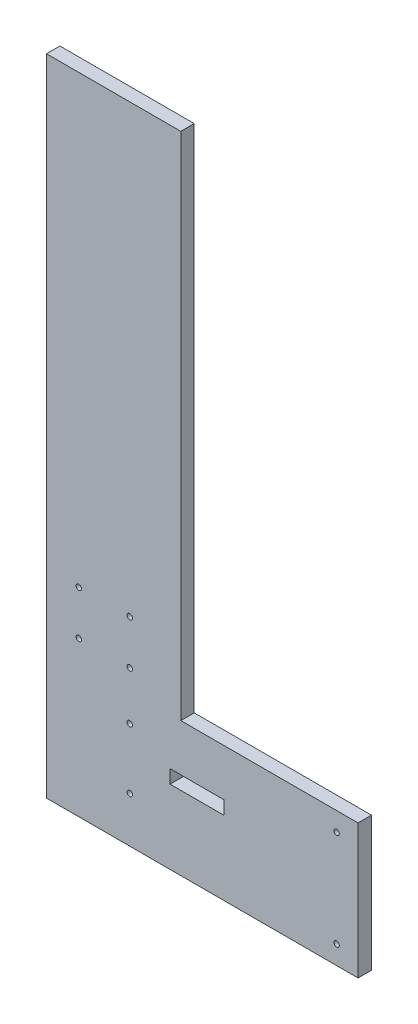
ISO-10303-21;
HEADER;
FILE_DESCRIPTION(('STEP AP214'),'2;1');
FILE_NAME('part.step','',(''),(''),'','','');
FILE_SCHEMA(('AUTOMOTIVE_DESIGN { 1 0 10303 214 1 1 1 1 }'));
ENDSEC;
DATA;
#1=APPLICATION_CONTEXT('core data for automotive mechanical design processes');
#2=APPLICATION_PROTOCOL_DEFINITION('international standard','automotive_design',2000,#1);
#3=PRODUCT_CONTEXT('',#1,'mechanical');
#4=PRODUCT('Part','Part','',(#3));
#5=PRODUCT_RELATED_PRODUCT_CATEGORY('part','',(#4));
#6=PRODUCT_DEFINITION_FORMATION('','',#4);
#7=PRODUCT_DEFINITION_CONTEXT('part definition',#1,'design');
#8=PRODUCT_DEFINITION('design','',#6,#7);
#9=PRODUCT_DEFINITION_SHAPE('','',#8);
#10=(LENGTH_UNIT() NAMED_UNIT(*) SI_UNIT(.MILLI.,.METRE.));
#11=(NAMED_UNIT(*) PLANE_ANGLE_UNIT() SI_UNIT($,.RADIAN.));
#12=(NAMED_UNIT(*) SI_UNIT($,.STERADIAN.) SOLID_ANGLE_UNIT());
#13=UNCERTAINTY_MEASURE_WITH_UNIT(LENGTH_MEASURE(1.E-05),#10,'distance_accuracy_value','');
#14=(GEOMETRIC_REPRESENTATION_CONTEXT(3) GLOBAL_UNCERTAINTY_ASSIGNED_CONTEXT((#13)) GLOBAL_UNIT_ASSIGNED_CONTEXT((#10,
#11,#12)) REPRESENTATION_CONTEXT('',''));
#15=CARTESIAN_POINT('',(0.,0.,0.));
#16=DIRECTION('',(0.,0.,1.));
#17=DIRECTION('',(1.,0.,0.));
#18=AXIS2_PLACEMENT_3D('',#15,#16,#17);
#19=CARTESIAN_POINT('',(0.,60.,5.));
#20=DIRECTION('',(0.,1.,0.));
#21=DIRECTION('',(-1.,0.,0.));
#22=AXIS2_PLACEMENT_3D('',#19,#20,#21);
#23=PLANE('',#22);
#24=DIRECTION('',(1.,0.,0.));
#25=VECTOR('',#24,1.);
#26=CARTESIAN_POINT('',(0.,60.,0.));
#27=LINE('',#26,#25);
#28=CARTESIAN_POINT('',(130.,60.,0.));
#29=VERTEX_POINT('',#28);
#30=CARTESIAN_POINT('',(246.,60.,0.));
#31=VERTEX_POINT('',#30);
#32=EDGE_CURVE('E186',#29,#31,#27,.T.);
#33=ORIENTED_EDGE('',*,*,#32,.T.);
#34=DIRECTION('',(0.,0.,-1.));
#35=VECTOR('',#34,1.);
#36=CARTESIAN_POINT('',(246.,60.,5.));
#37=LINE('',#36,#35);
#38=CARTESIAN_POINT('',(246.,60.,5.));
#39=VERTEX_POINT('',#38);
#40=EDGE_CURVE('E11',#39,#31,#37,.T.);
#41=ORIENTED_EDGE('',*,*,#40,.F.);
#42=DIRECTION('',(1.,0.,0.));
#43=VECTOR('',#42,1.);
#44=CARTESIAN_POINT('',(0.,60.,5.));
#45=LINE('',#44,#43);
#46=CARTESIAN_POINT('',(130.,60.,5.));
#47=VERTEX_POINT('',#46);
#48=EDGE_CURVE('E116',#47,#39,#45,.T.);
#49=ORIENTED_EDGE('',*,*,#48,.F.);
#50=DIRECTION('',(0.,0.,1.));
#51=VECTOR('',#50,1.);
#52=CARTESIAN_POINT('',(130.,60.,0.));
#53=LINE('',#52,#51);
#54=EDGE_CURVE('E126',#29,#47,#53,.T.);
#55=ORIENTED_EDGE('',*,*,#54,.F.);
#56=EDGE_LOOP('',(#33,#41,#49,#55));
#57=FACE_BOUND('',#56,.T.);
#58=ADVANCED_FACE('F35',(#57),#23,.F.);
#59=CARTESIAN_POINT('',(246.,0.,5.));
#60=DIRECTION('',(1.,0.,0.));
#61=DIRECTION('',(0.,0.,-1.));
#62=AXIS2_PLACEMENT_3D('',#59,#60,#61);
#63=PLANE('',#62);
#64=DIRECTION('',(0.,-1.,0.));
#65=VECTOR('',#64,1.);
#66=CARTESIAN_POINT('',(246.,0.,0.));
#67=LINE('',#66,#65);
#68=CARTESIAN_POINT('',(246.,110.,0.));
#69=VERTEX_POINT('',#68);
#70=EDGE_CURVE('E213',#69,#31,#67,.T.);
#71=ORIENTED_EDGE('',*,*,#70,.F.);
#72=DIRECTION('',(0.,0.,-1.));
#73=VECTOR('',#72,1.);
#74=CARTESIAN_POINT('',(246.,110.,5.));
#75=LINE('',#74,#73);
#76=CARTESIAN_POINT('',(246.,110.,5.));
#77=VERTEX_POINT('',#76);
#78=EDGE_CURVE('E42',#77,#69,#75,.T.);
#79=ORIENTED_EDGE('',*,*,#78,.F.);
#80=DIRECTION('',(0.,-1.,0.));
#81=VECTOR('',#80,1.);
#82=CARTESIAN_POINT('',(246.,0.,5.));
#83=LINE('',#82,#81);
#84=EDGE_CURVE('E128',#77,#39,#83,.T.);
#85=ORIENTED_EDGE('',*,*,#84,.T.);
#86=ORIENTED_EDGE('',*,*,#40,.T.);
#87=EDGE_LOOP('',(#71,#79,#85,#86));
#88=FACE_BOUND('',#87,.T.);
#89=ADVANCED_FACE('F242',(#88),#63,.T.);
#90=CARTESIAN_POINT('',(0.,110.,5.));
#91=DIRECTION('',(0.,1.,0.));
#92=DIRECTION('',(0.,0.,1.));
#93=AXIS2_PLACEMENT_3D('',#90,#91,#92);
#94=PLANE('',#93);
#95=DIRECTION('',(1.,0.,0.));
#96=VECTOR('',#95,1.);
#97=CARTESIAN_POINT('',(0.,110.,0.));
#98=LINE('',#97,#96);
#99=CARTESIAN_POINT('',(180.,110.,0.));
#100=VERTEX_POINT('',#99);
#101=EDGE_CURVE('E211',#100,#69,#98,.T.);
#102=ORIENTED_EDGE('',*,*,#101,.F.);
#103=DIRECTION('',(0.,0.,-1.));
#104=VECTOR('',#103,1.);
#105=CARTESIAN_POINT('',(180.,110.,5.));
#106=LINE('',#105,#104);
#107=CARTESIAN_POINT('',(180.,110.,5.));
#108=VERTEX_POINT('',#107);
#109=EDGE_CURVE('E235',#108,#100,#106,.T.);
#110=ORIENTED_EDGE('',*,*,#109,.F.);
#111=DIRECTION('',(1.,0.,0.));
#112=VECTOR('',#111,1.);
#113=CARTESIAN_POINT('',(0.,110.,5.));
#114=LINE('',#113,#112);
#115=EDGE_CURVE('E190',#108,#77,#114,.T.);
#116=ORIENTED_EDGE('',*,*,#115,.T.);
#117=ORIENTED_EDGE('',*,*,#78,.T.);
#118=EDGE_LOOP('',(#102,#110,#116,#117));
#119=FACE_BOUND('',#118,.T.);
#120=ADVANCED_FACE('F239',(#119),#94,.T.);
#121=CARTESIAN_POINT('',(180.,0.,5.));
#122=DIRECTION('',(-1.,0.,0.));
#123=DIRECTION('',(0.,-1.,0.));
#124=AXIS2_PLACEMENT_3D('',#121,#122,#123);
#125=PLANE('',#124);
#126=DIRECTION('',(0.,1.,0.));
#127=VECTOR('',#126,1.);
#128=CARTESIAN_POINT('',(180.,0.,0.));
#129=LINE('',#128,#127);
#130=CARTESIAN_POINT('',(180.,300.,0.));
#131=VERTEX_POINT('',#130);
#132=EDGE_CURVE('E208',#100,#131,#129,.T.);
#133=ORIENTED_EDGE('',*,*,#132,.T.);
#134=DIRECTION('',(0.,0.,-1.));
#135=VECTOR('',#134,1.);
#136=CARTESIAN_POINT('',(180.,300.,5.));
#137=LINE('',#136,#135);
#138=CARTESIAN_POINT('',(180.,300.,5.));
#139=VERTEX_POINT('',#138);
#140=EDGE_CURVE('E232',#139,#131,#137,.T.);
#141=ORIENTED_EDGE('',*,*,#140,.F.);
#142=DIRECTION('',(0.,1.,0.));
#143=VECTOR('',#142,1.);
#144=CARTESIAN_POINT('',(180.,0.,5.));
#145=LINE('',#144,#143);
#146=EDGE_CURVE('E189',#108,#139,#145,.T.);
#147=ORIENTED_EDGE('',*,*,#146,.F.);
#148=ORIENTED_EDGE('',*,*,#109,.T.);
#149=EDGE_LOOP('',(#133,#141,#147,#148));
#150=FACE_BOUND('',#149,.T.);
#151=ADVANCED_FACE('F250',(#150),#125,.F.);
#152=CARTESIAN_POINT('',(0.,300.,5.));
#153=DIRECTION('',(0.,-1.,0.));
#154=DIRECTION('',(0.,0.,-1.));
#155=AXIS2_PLACEMENT_3D('',#152,#153,#154);
#156=PLANE('',#155);
#157=DIRECTION('',(-1.,0.,0.));
#158=VECTOR('',#157,1.);
#159=CARTESIAN_POINT('',(0.,300.,0.));
#160=LINE('',#159,#158);
#161=CARTESIAN_POINT('',(130.,300.,0.));
#162=VERTEX_POINT('',#161);
#163=EDGE_CURVE('E210',#131,#162,#160,.T.);
#164=ORIENTED_EDGE('',*,*,#163,.T.);
#165=DIRECTION('',(0.,0.,-1.));
#166=VECTOR('',#165,1.);
#167=CARTESIAN_POINT('',(130.,300.,5.));
#168=LINE('',#167,#166);
#169=CARTESIAN_POINT('',(130.,300.,5.));
#170=VERTEX_POINT('',#169);
#171=EDGE_CURVE('E207',#170,#162,#168,.T.);
#172=ORIENTED_EDGE('',*,*,#171,.F.);
#173=DIRECTION('',(-1.,0.,0.));
#174=VECTOR('',#173,1.);
#175=CARTESIAN_POINT('',(0.,300.,5.));
#176=LINE('',#175,#174);
#177=EDGE_CURVE('E119',#139,#170,#176,.T.);
#178=ORIENTED_EDGE('',*,*,#177,.F.);
#179=ORIENTED_EDGE('',*,*,#140,.T.);
#180=EDGE_LOOP('',(#164,#172,#178,#179));
#181=FACE_BOUND('',#180,.T.);
#182=ADVANCED_FACE('F253',(#181),#156,.F.);
#183=CARTESIAN_POINT('',(130.,0.,5.));
#184=DIRECTION('',(1.,0.,0.));
#185=DIRECTION('',(0.,1.,0.));
#186=AXIS2_PLACEMENT_3D('',#183,#184,#185);
#187=PLANE('',#186);
#188=DIRECTION('',(0.,-1.,0.));
#189=VECTOR('',#188,1.);
#190=CARTESIAN_POINT('',(130.,0.,0.));
#191=LINE('',#190,#189);
#192=EDGE_CURVE('E49',#162,#29,#191,.T.);
#193=ORIENTED_EDGE('',*,*,#192,.T.);
#194=ORIENTED_EDGE('',*,*,#54,.T.);
#195=DIRECTION('',(0.,-1.,0.));
#196=VECTOR('',#195,1.);
#197=CARTESIAN_POINT('',(130.,0.,5.));
#198=LINE('',#197,#196);
#199=EDGE_CURVE('E111',#170,#47,#198,.T.);
#200=ORIENTED_EDGE('',*,*,#199,.F.);
#201=ORIENTED_EDGE('',*,*,#171,.T.);
#202=EDGE_LOOP('',(#193,#194,#200,#201));
#203=FACE_BOUND('',#202,.T.);
#204=ADVANCED_FACE('F131',(#203),#187,.F.);
#205=CARTESIAN_POINT('',(142.,117.5,5.));
#206=DIRECTION('',(0.,0.,-1.));
#207=DIRECTION('',(-1.,0.,0.));
#208=AXIS2_PLACEMENT_3D('',#205,#206,#207);
#209=CYLINDRICAL_SURFACE('',#208,0.999999999999998);
#210=CARTESIAN_POINT('',(142.,117.5,5.));
#211=DIRECTION('',(0.,0.,1.));
#212=DIRECTION('',(1.,0.,0.));
#213=AXIS2_PLACEMENT_3D('',#210,#211,#212);
#214=CIRCLE('',#213,0.999999999999998);
#215=CARTESIAN_POINT('',(143.,117.5,5.));
#216=VERTEX_POINT('',#215);
#217=EDGE_CURVE('E201',#216,#216,#214,.F.);
#218=ORIENTED_EDGE('',*,*,#217,.F.);
#219=EDGE_LOOP('',(#218));
#220=FACE_BOUND('',#219,.T.);
#221=CARTESIAN_POINT('',(142.,117.5,0.));
#222=DIRECTION('',(0.,0.,1.));
#223=DIRECTION('',(1.,0.,0.));
#224=AXIS2_PLACEMENT_3D('',#221,#222,#223);
#225=CIRCLE('',#224,0.999999999999998);
#226=CARTESIAN_POINT('',(143.,117.5,0.));
#227=VERTEX_POINT('',#226);
#228=EDGE_CURVE('E226',#227,#227,#225,.F.);
#229=ORIENTED_EDGE('',*,*,#228,.T.);
#230=EDGE_LOOP('',(#229));
#231=FACE_BOUND('',#230,.T.);
#232=ADVANCED_FACE('F261',(#220,#231),#209,.F.);
#233=CARTESIAN_POINT('',(161.,117.5,5.));
#234=DIRECTION('',(0.,0.,-1.));
#235=DIRECTION('',(-1.,0.,0.));
#236=AXIS2_PLACEMENT_3D('',#233,#234,#235);
#237=CYLINDRICAL_SURFACE('',#236,0.999999999999998);
#238=CARTESIAN_POINT('',(161.,117.5,5.));
#239=DIRECTION('',(0.,0.,1.));
#240=DIRECTION('',(1.,0.,0.));
#241=AXIS2_PLACEMENT_3D('',#238,#239,#240);
#242=CIRCLE('',#241,0.999999999999998);
#243=CARTESIAN_POINT('',(162.,117.5,5.));
#244=VERTEX_POINT('',#243);
#245=EDGE_CURVE('E198',#244,#244,#242,.F.);
#246=ORIENTED_EDGE('',*,*,#245,.F.);
#247=EDGE_LOOP('',(#246));
#248=FACE_BOUND('',#247,.T.);
#249=CARTESIAN_POINT('',(161.,117.5,0.));
#250=DIRECTION('',(0.,0.,1.));
#251=DIRECTION('',(1.,0.,0.));
#252=AXIS2_PLACEMENT_3D('',#249,#250,#251);
#253=CIRCLE('',#252,0.999999999999998);
#254=CARTESIAN_POINT('',(162.,117.5,0.));
#255=VERTEX_POINT('',#254);
#256=EDGE_CURVE('E223',#255,#255,#253,.F.);
#257=ORIENTED_EDGE('',*,*,#256,.T.);
#258=EDGE_LOOP('',(#257));
#259=FACE_BOUND('',#258,.T.);
#260=ADVANCED_FACE('F292',(#248,#259),#237,.F.);
#261=CARTESIAN_POINT('',(142.,134.,5.));
#262=DIRECTION('',(0.,0.,-1.));
#263=DIRECTION('',(-1.,0.,0.));
#264=AXIS2_PLACEMENT_3D('',#261,#262,#263);
#265=CYLINDRICAL_SURFACE('',#264,0.999999999999998);
#266=CARTESIAN_POINT('',(142.,134.,5.));
#267=DIRECTION('',(0.,0.,1.));
#268=DIRECTION('',(1.,0.,0.));
#269=AXIS2_PLACEMENT_3D('',#266,#267,#268);
#270=CIRCLE('',#269,0.999999999999998);
#271=CARTESIAN_POINT('',(143.,134.,5.));
#272=VERTEX_POINT('',#271);
#273=EDGE_CURVE('E121',#272,#272,#270,.F.);
#274=ORIENTED_EDGE('',*,*,#273,.F.);
#275=EDGE_LOOP('',(#274));
#276=FACE_BOUND('',#275,.T.);
#277=CARTESIAN_POINT('',(142.,134.,0.));
#278=DIRECTION('',(0.,0.,1.));
#279=DIRECTION('',(1.,0.,0.));
#280=AXIS2_PLACEMENT_3D('',#277,#278,#279);
#281=CIRCLE('',#280,0.999999999999998);
#282=CARTESIAN_POINT('',(143.,134.,0.));
#283=VERTEX_POINT('',#282);
#284=EDGE_CURVE('E220',#283,#283,#281,.F.);
#285=ORIENTED_EDGE('',*,*,#284,.T.);
#286=EDGE_LOOP('',(#285));
#287=FACE_BOUND('',#286,.T.);
#288=ADVANCED_FACE('F302',(#276,#287),#265,.F.);
#289=CARTESIAN_POINT('',(161.,134.,5.));
#290=DIRECTION('',(0.,0.,-1.));
#291=DIRECTION('',(-1.,0.,0.));
#292=AXIS2_PLACEMENT_3D('',#289,#290,#291);
#293=CYLINDRICAL_SURFACE('',#292,0.999999999999998);
#294=CARTESIAN_POINT('',(161.,134.,5.));
#295=DIRECTION('',(0.,0.,1.));
#296=DIRECTION('',(1.,0.,0.));
#297=AXIS2_PLACEMENT_3D('',#294,#295,#296);
#298=CIRCLE('',#297,0.999999999999998);
#299=CARTESIAN_POINT('',(162.,134.,5.));
#300=VERTEX_POINT('',#299);
#301=EDGE_CURVE('E204',#300,#300,#298,.F.);
#302=ORIENTED_EDGE('',*,*,#301,.F.);
#303=EDGE_LOOP('',(#302));
#304=FACE_BOUND('',#303,.T.);
#305=CARTESIAN_POINT('',(161.,134.,0.));
#306=DIRECTION('',(0.,0.,1.));
#307=DIRECTION('',(1.,0.,0.));
#308=AXIS2_PLACEMENT_3D('',#305,#306,#307);
#309=CIRCLE('',#308,0.999999999999998);
#310=CARTESIAN_POINT('',(162.,134.,0.));
#311=VERTEX_POINT('',#310);
#312=EDGE_CURVE('E129',#311,#311,#309,.F.);
#313=ORIENTED_EDGE('',*,*,#312,.T.);
#314=EDGE_LOOP('',(#313));
#315=FACE_BOUND('',#314,.T.);
#316=ADVANCED_FACE('F312',(#304,#315),#293,.F.);
#317=CARTESIAN_POINT('',(0.,0.,5.));
#318=DIRECTION('',(0.,0.,1.));
#319=DIRECTION('',(1.,0.,0.));
#320=AXIS2_PLACEMENT_3D('',#317,#318,#319);
#321=PLANE('',#320);
#322=ORIENTED_EDGE('',*,*,#199,.T.);
#323=ORIENTED_EDGE('',*,*,#48,.T.);
#324=ORIENTED_EDGE('',*,*,#84,.F.);
#325=ORIENTED_EDGE('',*,*,#115,.F.);
#326=ORIENTED_EDGE('',*,*,#146,.T.);
#327=ORIENTED_EDGE('',*,*,#177,.T.);
#328=EDGE_LOOP('',(#322,#323,#324,#325,#326,#327));
#329=FACE_BOUND('',#328,.T.);
#330=DIRECTION('',(-1.,0.,0.));
#331=VECTOR('',#330,1.);
#332=CARTESIAN_POINT('',(196.,92.5,5.));
#333=LINE('',#332,#331);
#334=CARTESIAN_POINT('',(196.,92.5,5.));
#335=VERTEX_POINT('',#334);
#336=CARTESIAN_POINT('',(176.,92.5,5.));
#337=VERTEX_POINT('',#336);
#338=EDGE_CURVE('E57',#335,#337,#333,.T.);
#339=ORIENTED_EDGE('',*,*,#338,.F.);
#340=DIRECTION('',(0.,1.,0.));
#341=VECTOR('',#340,1.);
#342=CARTESIAN_POINT('',(196.,92.5,5.));
#343=LINE('',#342,#341);
#344=CARTESIAN_POINT('',(196.,87.5,5.));
#345=VERTEX_POINT('',#344);
#346=EDGE_CURVE('E140',#345,#335,#343,.T.);
#347=ORIENTED_EDGE('',*,*,#346,.F.);
#348=DIRECTION('',(1.,0.,0.));
#349=VECTOR('',#348,1.);
#350=CARTESIAN_POINT('',(196.,87.5,5.));
#351=LINE('',#350,#349);
#352=CARTESIAN_POINT('',(176.,87.5,5.));
#353=VERTEX_POINT('',#352);
#354=EDGE_CURVE('E152',#353,#345,#351,.T.);
#355=ORIENTED_EDGE('',*,*,#354,.F.);
#356=DIRECTION('',(0.,-1.,0.));
#357=VECTOR('',#356,1.);
#358=CARTESIAN_POINT('',(176.,92.5,5.));
#359=LINE('',#358,#357);
#360=EDGE_CURVE('E133',#337,#353,#359,.T.);
#361=ORIENTED_EDGE('',*,*,#360,.F.);
#362=EDGE_LOOP('',(#339,#347,#355,#361));
#363=FACE_BOUND('',#362,.T.);
#364=CARTESIAN_POINT('',(161.,99.5,5.));
#365=DIRECTION('',(0.,0.,1.));
#366=DIRECTION('',(-1.,0.,0.));
#367=AXIS2_PLACEMENT_3D('',#364,#365,#366);
#368=CIRCLE('',#367,1.00000000000002);
#369=CARTESIAN_POINT('',(160.,99.5,5.));
#370=VERTEX_POINT('',#369);
#371=EDGE_CURVE('E159',#370,#370,#368,.T.);
#372=ORIENTED_EDGE('',*,*,#371,.F.);
#373=EDGE_LOOP('',(#372));
#374=FACE_BOUND('',#373,.T.);
#375=CARTESIAN_POINT('',(161.,77.,5.));
#376=DIRECTION('',(0.,0.,1.));
#377=DIRECTION('',(-1.,0.,0.));
#378=AXIS2_PLACEMENT_3D('',#375,#376,#377);
#379=CIRCLE('',#378,1.00000000000002);
#380=CARTESIAN_POINT('',(160.,77.,5.));
#381=VERTEX_POINT('',#380);
#382=EDGE_CURVE('E168',#381,#381,#379,.T.);
#383=ORIENTED_EDGE('',*,*,#382,.F.);
#384=EDGE_LOOP('',(#383));
#385=FACE_BOUND('',#384,.T.);
#386=CARTESIAN_POINT('',(238.,103.,5.));
#387=DIRECTION('',(0.,0.,1.));
#388=DIRECTION('',(-1.,0.,0.));
#389=AXIS2_PLACEMENT_3D('',#386,#387,#388);
#390=CIRCLE('',#389,0.999999999999998);
#391=CARTESIAN_POINT('',(237.,103.,5.));
#392=VERTEX_POINT('',#391);
#393=EDGE_CURVE('E174',#392,#392,#390,.T.);
#394=ORIENTED_EDGE('',*,*,#393,.F.);
#395=EDGE_LOOP('',(#394));
#396=FACE_BOUND('',#395,.T.);
#397=CARTESIAN_POINT('',(238.,67.,5.));
#398=DIRECTION('',(0.,0.,1.));
#399=DIRECTION('',(-1.,0.,0.));
#400=AXIS2_PLACEMENT_3D('',#397,#398,#399);
#401=CIRCLE('',#400,0.999999999999998);
#402=CARTESIAN_POINT('',(237.,67.,5.));
#403=VERTEX_POINT('',#402);
#404=EDGE_CURVE('E180',#403,#403,#401,.T.);
#405=ORIENTED_EDGE('',*,*,#404,.F.);
#406=EDGE_LOOP('',(#405));
#407=FACE_BOUND('',#406,.T.);
#408=ORIENTED_EDGE('',*,*,#273,.T.);
#409=EDGE_LOOP('',(#408));
#410=FACE_BOUND('',#409,.T.);
#411=ORIENTED_EDGE('',*,*,#245,.T.);
#412=EDGE_LOOP('',(#411));
#413=FACE_BOUND('',#412,.T.);
#414=ORIENTED_EDGE('',*,*,#217,.T.);
#415=EDGE_LOOP('',(#414));
#416=FACE_BOUND('',#415,.T.);
#417=ORIENTED_EDGE('',*,*,#301,.T.);
#418=EDGE_LOOP('',(#417));
#419=FACE_BOUND('',#418,.T.);
#420=ADVANCED_FACE('F113',(#329,#363,#374,#385,#396,#407,#410,#413,#416,#419),#321,.T.);
#421=CARTESIAN_POINT('',(0.,0.,0.));
#422=DIRECTION('',(0.,0.,1.));
#423=DIRECTION('',(1.,0.,0.));
#424=AXIS2_PLACEMENT_3D('',#421,#422,#423);
#425=PLANE('',#424);
#426=DIRECTION('',(0.,1.,0.));
#427=VECTOR('',#426,1.);
#428=CARTESIAN_POINT('',(196.,92.5,0.));
#429=LINE('',#428,#427);
#430=CARTESIAN_POINT('',(196.,87.5,0.));
#431=VERTEX_POINT('',#430);
#432=CARTESIAN_POINT('',(196.,92.5,0.));
#433=VERTEX_POINT('',#432);
#434=EDGE_CURVE('E146',#431,#433,#429,.T.);
#435=ORIENTED_EDGE('',*,*,#434,.T.);
#436=DIRECTION('',(-1.,0.,0.));
#437=VECTOR('',#436,1.);
#438=CARTESIAN_POINT('',(196.,92.5,0.));
#439=LINE('',#438,#437);
#440=CARTESIAN_POINT('',(176.,92.5,0.));
#441=VERTEX_POINT('',#440);
#442=EDGE_CURVE('E136',#433,#441,#439,.T.);
#443=ORIENTED_EDGE('',*,*,#442,.T.);
#444=DIRECTION('',(0.,-1.,0.));
#445=VECTOR('',#444,1.);
#446=CARTESIAN_POINT('',(176.,92.5,0.));
#447=LINE('',#446,#445);
#448=CARTESIAN_POINT('',(176.,87.5,0.));
#449=VERTEX_POINT('',#448);
#450=EDGE_CURVE('E139',#441,#449,#447,.T.);
#451=ORIENTED_EDGE('',*,*,#450,.T.);
#452=DIRECTION('',(1.,0.,0.));
#453=VECTOR('',#452,1.);
#454=CARTESIAN_POINT('',(196.,87.5,0.));
#455=LINE('',#454,#453);
#456=EDGE_CURVE('E143',#449,#431,#455,.T.);
#457=ORIENTED_EDGE('',*,*,#456,.T.);
#458=EDGE_LOOP('',(#435,#443,#451,#457));
#459=FACE_BOUND('',#458,.T.);
#460=CARTESIAN_POINT('',(161.,99.5,0.));
#461=DIRECTION('',(0.,0.,1.));
#462=DIRECTION('',(-1.,0.,0.));
#463=AXIS2_PLACEMENT_3D('',#460,#461,#462);
#464=CIRCLE('',#463,1.00000000000002);
#465=CARTESIAN_POINT('',(160.,99.5,0.));
#466=VERTEX_POINT('',#465);
#467=EDGE_CURVE('E165',#466,#466,#464,.T.);
#468=ORIENTED_EDGE('',*,*,#467,.T.);
#469=EDGE_LOOP('',(#468));
#470=FACE_BOUND('',#469,.T.);
#471=CARTESIAN_POINT('',(161.,77.,0.));
#472=DIRECTION('',(0.,0.,1.));
#473=DIRECTION('',(-1.,0.,0.));
#474=AXIS2_PLACEMENT_3D('',#471,#472,#473);
#475=CIRCLE('',#474,1.00000000000002);
#476=CARTESIAN_POINT('',(160.,77.,0.));
#477=VERTEX_POINT('',#476);
#478=EDGE_CURVE('E171',#477,#477,#475,.T.);
#479=ORIENTED_EDGE('',*,*,#478,.T.);
#480=EDGE_LOOP('',(#479));
#481=FACE_BOUND('',#480,.T.);
#482=CARTESIAN_POINT('',(238.,103.,0.));
#483=DIRECTION('',(0.,0.,1.));
#484=DIRECTION('',(-1.,0.,0.));
#485=AXIS2_PLACEMENT_3D('',#482,#483,#484);
#486=CIRCLE('',#485,0.999999999999998);
#487=CARTESIAN_POINT('',(237.,103.,0.));
#488=VERTEX_POINT('',#487);
#489=EDGE_CURVE('E177',#488,#488,#486,.T.);
#490=ORIENTED_EDGE('',*,*,#489,.T.);
#491=EDGE_LOOP('',(#490));
#492=FACE_BOUND('',#491,.T.);
#493=CARTESIAN_POINT('',(238.,67.,0.));
#494=DIRECTION('',(0.,0.,1.));
#495=DIRECTION('',(-1.,0.,0.));
#496=AXIS2_PLACEMENT_3D('',#493,#494,#495);
#497=CIRCLE('',#496,0.999999999999998);
#498=CARTESIAN_POINT('',(237.,67.,0.));
#499=VERTEX_POINT('',#498);
#500=EDGE_CURVE('E183',#499,#499,#497,.T.);
#501=ORIENTED_EDGE('',*,*,#500,.T.);
#502=EDGE_LOOP('',(#501));
#503=FACE_BOUND('',#502,.T.);
#504=ORIENTED_EDGE('',*,*,#32,.F.);
#505=ORIENTED_EDGE('',*,*,#192,.F.);
#506=ORIENTED_EDGE('',*,*,#163,.F.);
#507=ORIENTED_EDGE('',*,*,#132,.F.);
#508=ORIENTED_EDGE('',*,*,#101,.T.);
#509=ORIENTED_EDGE('',*,*,#70,.T.);
#510=EDGE_LOOP('',(#504,#505,#506,#507,#508,#509));
#511=FACE_BOUND('',#510,.T.);
#512=ORIENTED_EDGE('',*,*,#284,.F.);
#513=EDGE_LOOP('',(#512));
#514=FACE_BOUND('',#513,.T.);
#515=ORIENTED_EDGE('',*,*,#256,.F.);
#516=EDGE_LOOP('',(#515));
#517=FACE_BOUND('',#516,.T.);
#518=ORIENTED_EDGE('',*,*,#228,.F.);
#519=EDGE_LOOP('',(#518));
#520=FACE_BOUND('',#519,.T.);
#521=ORIENTED_EDGE('',*,*,#312,.F.);
#522=EDGE_LOOP('',(#521));
#523=FACE_BOUND('',#522,.T.);
#524=ADVANCED_FACE('F245',(#459,#470,#481,#492,#503,#511,#514,#517,#520,#523),#425,.F.);
#525=CARTESIAN_POINT('',(238.,67.,0.));
#526=DIRECTION('',(0.,0.,1.));
#527=DIRECTION('',(1.,0.,0.));
#528=AXIS2_PLACEMENT_3D('',#525,#526,#527);
#529=CYLINDRICAL_SURFACE('',#528,0.999999999999998);
#530=ORIENTED_EDGE('',*,*,#500,.F.);
#531=EDGE_LOOP('',(#530));
#532=FACE_BOUND('',#531,.T.);
#533=ORIENTED_EDGE('',*,*,#404,.T.);
#534=EDGE_LOOP('',(#533));
#535=FACE_BOUND('',#534,.T.);
#536=ADVANCED_FACE('F329',(#532,#535),#529,.F.);
#537=CARTESIAN_POINT('',(238.,103.,0.));
#538=DIRECTION('',(0.,0.,1.));
#539=DIRECTION('',(1.,0.,0.));
#540=AXIS2_PLACEMENT_3D('',#537,#538,#539);
#541=CYLINDRICAL_SURFACE('',#540,0.999999999999998);
#542=ORIENTED_EDGE('',*,*,#489,.F.);
#543=EDGE_LOOP('',(#542));
#544=FACE_BOUND('',#543,.T.);
#545=ORIENTED_EDGE('',*,*,#393,.T.);
#546=EDGE_LOOP('',(#545));
#547=FACE_BOUND('',#546,.T.);
#548=ADVANCED_FACE('F334',(#544,#547),#541,.F.);
#549=CARTESIAN_POINT('',(161.,77.,0.));
#550=DIRECTION('',(0.,0.,1.));
#551=DIRECTION('',(1.,0.,0.));
#552=AXIS2_PLACEMENT_3D('',#549,#550,#551);
#553=CYLINDRICAL_SURFACE('',#552,1.00000000000002);
#554=ORIENTED_EDGE('',*,*,#478,.F.);
#555=EDGE_LOOP('',(#554));
#556=FACE_BOUND('',#555,.T.);
#557=ORIENTED_EDGE('',*,*,#382,.T.);
#558=EDGE_LOOP('',(#557));
#559=FACE_BOUND('',#558,.T.);
#560=ADVANCED_FACE('F346',(#556,#559),#553,.F.);
#561=CARTESIAN_POINT('',(161.,99.5,0.));
#562=DIRECTION('',(0.,0.,1.));
#563=DIRECTION('',(1.,0.,0.));
#564=AXIS2_PLACEMENT_3D('',#561,#562,#563);
#565=CYLINDRICAL_SURFACE('',#564,1.00000000000002);
#566=ORIENTED_EDGE('',*,*,#467,.F.);
#567=EDGE_LOOP('',(#566));
#568=FACE_BOUND('',#567,.T.);
#569=ORIENTED_EDGE('',*,*,#371,.T.);
#570=EDGE_LOOP('',(#569));
#571=FACE_BOUND('',#570,.T.);
#572=ADVANCED_FACE('F356',(#568,#571),#565,.F.);
#573=CARTESIAN_POINT('',(196.,92.5,0.));
#574=DIRECTION('',(0.,1.,0.));
#575=DIRECTION('',(0.,0.,1.));
#576=AXIS2_PLACEMENT_3D('',#573,#574,#575);
#577=PLANE('',#576);
#578=ORIENTED_EDGE('',*,*,#338,.T.);
#579=DIRECTION('',(0.,0.,1.));
#580=VECTOR('',#579,1.);
#581=CARTESIAN_POINT('',(176.,92.5,0.));
#582=LINE('',#581,#580);
#583=EDGE_CURVE('E148',#441,#337,#582,.T.);
#584=ORIENTED_EDGE('',*,*,#583,.F.);
#585=ORIENTED_EDGE('',*,*,#442,.F.);
#586=DIRECTION('',(0.,0.,1.));
#587=VECTOR('',#586,1.);
#588=CARTESIAN_POINT('',(196.,92.5,0.));
#589=LINE('',#588,#587);
#590=EDGE_CURVE('E157',#433,#335,#589,.T.);
#591=ORIENTED_EDGE('',*,*,#590,.T.);
#592=EDGE_LOOP('',(#578,#584,#585,#591));
#593=FACE_BOUND('',#592,.T.);
#594=ADVANCED_FACE('F366',(#593),#577,.F.);
#595=CARTESIAN_POINT('',(196.,92.5,0.));
#596=DIRECTION('',(1.,0.,0.));
#597=DIRECTION('',(0.,0.,-1.));
#598=AXIS2_PLACEMENT_3D('',#595,#596,#597);
#599=PLANE('',#598);
#600=ORIENTED_EDGE('',*,*,#346,.T.);
#601=ORIENTED_EDGE('',*,*,#590,.F.);
#602=ORIENTED_EDGE('',*,*,#434,.F.);
#603=DIRECTION('',(0.,0.,1.));
#604=VECTOR('',#603,1.);
#605=CARTESIAN_POINT('',(196.,87.5,0.));
#606=LINE('',#605,#604);
#607=EDGE_CURVE('E160',#431,#345,#606,.T.);
#608=ORIENTED_EDGE('',*,*,#607,.T.);
#609=EDGE_LOOP('',(#600,#601,#602,#608));
#610=FACE_BOUND('',#609,.T.);
#611=ADVANCED_FACE('F376',(#610),#599,.F.);
#612=CARTESIAN_POINT('',(196.,87.5,0.));
#613=DIRECTION('',(0.,-1.,0.));
#614=DIRECTION('',(0.,0.,-1.));
#615=AXIS2_PLACEMENT_3D('',#612,#613,#614);
#616=PLANE('',#615);
#617=ORIENTED_EDGE('',*,*,#354,.T.);
#618=ORIENTED_EDGE('',*,*,#607,.F.);
#619=ORIENTED_EDGE('',*,*,#456,.F.);
#620=DIRECTION('',(0.,0.,1.));
#621=VECTOR('',#620,1.);
#622=CARTESIAN_POINT('',(176.,87.5,0.));
#623=LINE('',#622,#621);
#624=EDGE_CURVE('E162',#449,#353,#623,.T.);
#625=ORIENTED_EDGE('',*,*,#624,.T.);
#626=EDGE_LOOP('',(#617,#618,#619,#625));
#627=FACE_BOUND('',#626,.T.);
#628=ADVANCED_FACE('F385',(#627),#616,.F.);
#629=CARTESIAN_POINT('',(176.,92.5,0.));
#630=DIRECTION('',(-1.,0.,0.));
#631=DIRECTION('',(0.,0.,1.));
#632=AXIS2_PLACEMENT_3D('',#629,#630,#631);
#633=PLANE('',#632);
#634=ORIENTED_EDGE('',*,*,#360,.T.);
#635=ORIENTED_EDGE('',*,*,#624,.F.);
#636=ORIENTED_EDGE('',*,*,#450,.F.);
#637=ORIENTED_EDGE('',*,*,#583,.T.);
#638=EDGE_LOOP('',(#634,#635,#636,#637));
#639=FACE_BOUND('',#638,.T.);
#640=ADVANCED_FACE('F395',(#639),#633,.F.);
#641=CLOSED_SHELL('',(#58,#89,#120,#151,#182,#204,#232,#260,#288,#316,#420,#524,#536,#548,#560,
#572,#594,#611,#628,#640));
#642=MANIFOLD_SOLID_BREP('B2',#641);
#643=ADVANCED_BREP_SHAPE_REPRESENTATION('',(#18,#642),#14);
#644=SHAPE_DEFINITION_REPRESENTATION(#9,#643);
ENDSEC;
END-ISO-10303-21;
